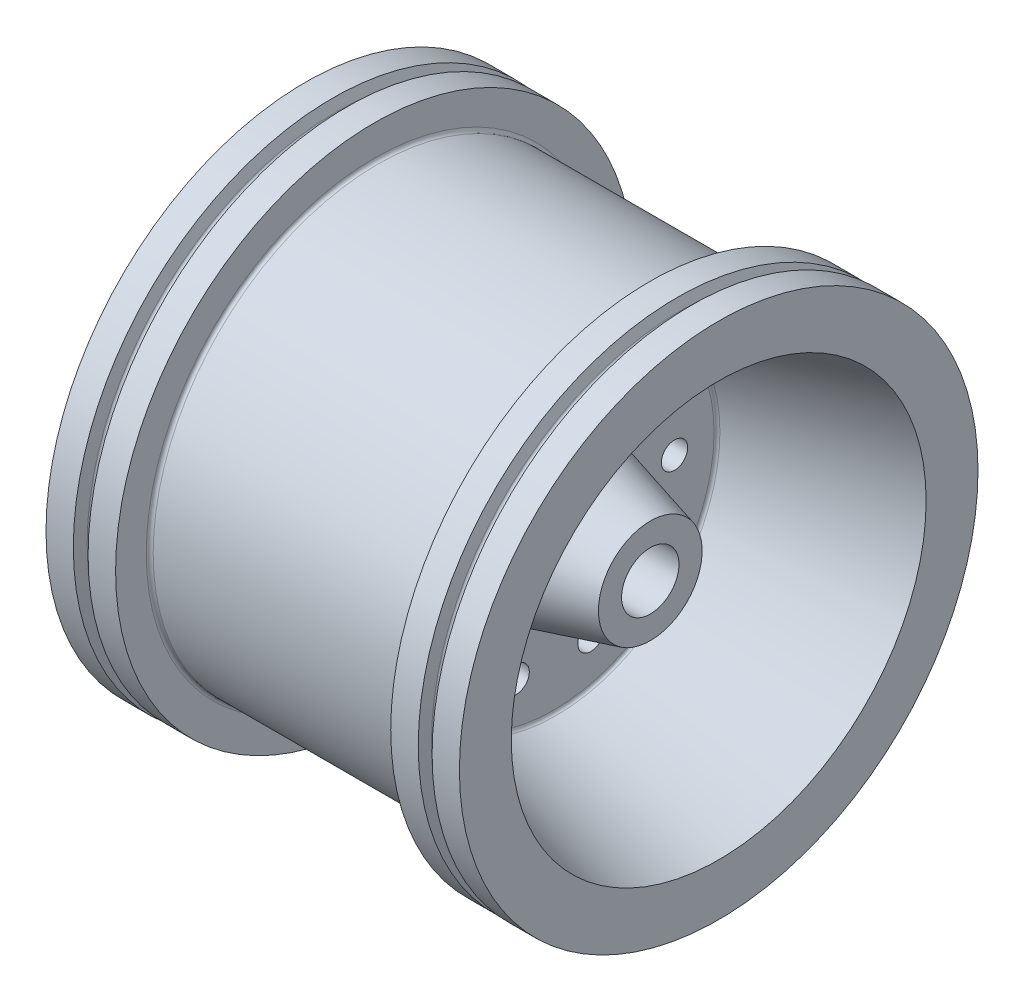
ISO-10303-21;
HEADER;
FILE_DESCRIPTION(('STEP AP214'),'2;1');
FILE_NAME('part.step','',(''),(''),'','','');
FILE_SCHEMA(('AUTOMOTIVE_DESIGN { 1 0 10303 214 1 1 1 1 }'));
ENDSEC;
DATA;
#1=APPLICATION_CONTEXT('core data for automotive mechanical design processes');
#2=APPLICATION_PROTOCOL_DEFINITION('international standard','automotive_design',2000,#1);
#3=PRODUCT_CONTEXT('',#1,'mechanical');
#4=PRODUCT('Part','Part','',(#3));
#5=PRODUCT_RELATED_PRODUCT_CATEGORY('part','',(#4));
#6=PRODUCT_DEFINITION_FORMATION('','',#4);
#7=PRODUCT_DEFINITION_CONTEXT('part definition',#1,'design');
#8=PRODUCT_DEFINITION('design','',#6,#7);
#9=PRODUCT_DEFINITION_SHAPE('','',#8);
#10=(LENGTH_UNIT() NAMED_UNIT(*) SI_UNIT(.MILLI.,.METRE.));
#11=(NAMED_UNIT(*) PLANE_ANGLE_UNIT() SI_UNIT($,.RADIAN.));
#12=(NAMED_UNIT(*) SI_UNIT($,.STERADIAN.) SOLID_ANGLE_UNIT());
#13=UNCERTAINTY_MEASURE_WITH_UNIT(LENGTH_MEASURE(1.E-05),#10,'distance_accuracy_value','');
#14=(GEOMETRIC_REPRESENTATION_CONTEXT(3) GLOBAL_UNCERTAINTY_ASSIGNED_CONTEXT((#13)) GLOBAL_UNIT_ASSIGNED_CONTEXT((#10,
#11,#12)) REPRESENTATION_CONTEXT('',''));
#15=CARTESIAN_POINT('',(0.,0.,0.));
#16=DIRECTION('',(0.,0.,1.));
#17=DIRECTION('',(1.,0.,0.));
#18=AXIS2_PLACEMENT_3D('',#15,#16,#17);
#19=CARTESIAN_POINT('',(-439.542794810868,0.,0.));
#20=DIRECTION('',(-1.,0.,0.));
#21=DIRECTION('',(0.,0.,1.));
#22=AXIS2_PLACEMENT_3D('',#19,#20,#21);
#23=CYLINDRICAL_SURFACE('',#22,8.30861206738148);
#24=CARTESIAN_POINT('',(40.,0.,0.));
#25=DIRECTION('',(-1.,0.,0.));
#26=DIRECTION('',(0.,0.,1.));
#27=AXIS2_PLACEMENT_3D('',#24,#25,#26);
#28=CIRCLE('',#27,8.30861206738148);
#29=CARTESIAN_POINT('',(40.,0.,8.30861206738148));
#30=VERTEX_POINT('',#29);
#31=EDGE_CURVE('E178',#30,#30,#28,.T.);
#32=ORIENTED_EDGE('',*,*,#31,.F.);
#33=EDGE_LOOP('',(#32));
#34=FACE_BOUND('',#33,.T.);
#35=CARTESIAN_POINT('',(-33.1,0.,0.));
#36=DIRECTION('',(-1.,0.,0.));
#37=DIRECTION('',(0.,0.,1.));
#38=AXIS2_PLACEMENT_3D('',#35,#36,#37);
#39=CIRCLE('',#38,8.30861206738148);
#40=CARTESIAN_POINT('',(-33.1,0.,8.30861206738148));
#41=VERTEX_POINT('',#40);
#42=EDGE_CURVE('E124',#41,#41,#39,.F.);
#43=ORIENTED_EDGE('',*,*,#42,.F.);
#44=EDGE_LOOP('',(#43));
#45=FACE_BOUND('',#44,.T.);
#46=ADVANCED_FACE('F43',(#34,#45),#23,.F.);
#47=CARTESIAN_POINT('',(12.0096189432335,47.1969361522712,0.));
#48=DIRECTION('',(-1.,0.,0.));
#49=DIRECTION('',(0.,0.,1.));
#50=AXIS2_PLACEMENT_3D('',#47,#48,#49);
#51=PLANE('',#50);
#52=CARTESIAN_POINT('',(12.0096189432335,0.,0.));
#53=DIRECTION('',(-1.,0.,0.));
#54=DIRECTION('',(0.,0.,1.));
#55=AXIS2_PLACEMENT_3D('',#52,#53,#54);
#56=CIRCLE('',#55,46.4296091642922);
#57=CARTESIAN_POINT('',(12.0096189432335,0.,46.4296091642922));
#58=VERTEX_POINT('',#57);
#59=EDGE_CURVE('E51',#58,#58,#56,.F.);
#60=ORIENTED_EDGE('',*,*,#59,.T.);
#61=EDGE_LOOP('',(#60));
#62=FACE_BOUND('',#61,.T.);
#63=CARTESIAN_POINT('',(12.0096189432335,0.,0.));
#64=DIRECTION('',(-1.,0.,0.));
#65=DIRECTION('',(0.,0.,1.));
#66=AXIS2_PLACEMENT_3D('',#63,#64,#65);
#67=CIRCLE('',#66,23.267326987979);
#68=CARTESIAN_POINT('',(12.0096189432335,0.,23.267326987979));
#69=VERTEX_POINT('',#68);
#70=EDGE_CURVE('E56',#69,#69,#67,.T.);
#71=ORIENTED_EDGE('',*,*,#70,.T.);
#72=EDGE_LOOP('',(#71));
#73=FACE_BOUND('',#72,.T.);
#74=CARTESIAN_POINT('',(12.0096189432335,-20.5724838302362,-28.3155948031234));
#75=DIRECTION('',(1.,0.,0.));
#76=DIRECTION('',(0.,0.,-1.));
#77=AXIS2_PLACEMENT_3D('',#74,#75,#76);
#78=CIRCLE('',#77,3.81000000000002);
#79=CARTESIAN_POINT('',(12.0096189432335,-20.5724838302362,-32.1255948031235));
#80=VERTEX_POINT('',#79);
#81=EDGE_CURVE('E128',#80,#80,#78,.T.);
#82=ORIENTED_EDGE('',*,*,#81,.F.);
#83=EDGE_LOOP('',(#82));
#84=FACE_BOUND('',#83,.T.);
#85=CARTESIAN_POINT('',(12.0096189432335,-33.2869780703303,-10.8155948031235));
#86=DIRECTION('',(1.,0.,0.));
#87=DIRECTION('',(0.,0.,-1.));
#88=AXIS2_PLACEMENT_3D('',#85,#86,#87);
#89=CIRCLE('',#88,3.81000000000002);
#90=CARTESIAN_POINT('',(12.0096189432335,-33.2869780703303,-14.6255948031236));
#91=VERTEX_POINT('',#90);
#92=EDGE_CURVE('E134',#91,#91,#89,.T.);
#93=ORIENTED_EDGE('',*,*,#92,.F.);
#94=EDGE_LOOP('',(#93));
#95=FACE_BOUND('',#94,.T.);
#96=CARTESIAN_POINT('',(12.0096189432335,-33.2869780703305,10.8155948031228));
#97=DIRECTION('',(1.,0.,0.));
#98=DIRECTION('',(0.,0.,-1.));
#99=AXIS2_PLACEMENT_3D('',#96,#97,#98);
#100=CIRCLE('',#99,3.81000000000002);
#101=CARTESIAN_POINT('',(12.0096189432335,-33.2869780703305,7.00559480312282));
#102=VERTEX_POINT('',#101);
#103=EDGE_CURVE('E139',#102,#102,#100,.T.);
#104=ORIENTED_EDGE('',*,*,#103,.F.);
#105=EDGE_LOOP('',(#104));
#106=FACE_BOUND('',#105,.T.);
#107=CARTESIAN_POINT('',(12.0096189432335,-20.5724838302368,28.315594803123));
#108=DIRECTION('',(1.,0.,0.));
#109=DIRECTION('',(0.,0.,-1.));
#110=AXIS2_PLACEMENT_3D('',#107,#108,#109);
#111=CIRCLE('',#110,3.81000000000002);
#112=CARTESIAN_POINT('',(12.0096189432335,-20.5724838302368,24.505594803123));
#113=VERTEX_POINT('',#112);
#114=EDGE_CURVE('E144',#113,#113,#111,.T.);
#115=ORIENTED_EDGE('',*,*,#114,.F.);
#116=EDGE_LOOP('',(#115));
#117=FACE_BOUND('',#116,.T.);
#118=CARTESIAN_POINT('',(12.0096189432335,0.,35.));
#119=DIRECTION('',(1.,0.,0.));
#120=DIRECTION('',(0.,0.,-1.));
#121=AXIS2_PLACEMENT_3D('',#118,#119,#120);
#122=CIRCLE('',#121,3.81000000000002);
#123=CARTESIAN_POINT('',(12.0096189432335,0.,31.19));
#124=VERTEX_POINT('',#123);
#125=EDGE_CURVE('E149',#124,#124,#122,.T.);
#126=ORIENTED_EDGE('',*,*,#125,.F.);
#127=EDGE_LOOP('',(#126));
#128=FACE_BOUND('',#127,.T.);
#129=CARTESIAN_POINT('',(12.0096189432335,33.2869780703303,10.8155948031233));
#130=DIRECTION('',(1.,0.,0.));
#131=DIRECTION('',(0.,0.,-1.));
#132=AXIS2_PLACEMENT_3D('',#129,#130,#131);
#133=CIRCLE('',#132,3.81000000000002);
#134=CARTESIAN_POINT('',(12.0096189432335,33.2869780703303,7.00559480312329));
#135=VERTEX_POINT('',#134);
#136=EDGE_CURVE('E234',#135,#135,#133,.T.);
#137=ORIENTED_EDGE('',*,*,#136,.F.);
#138=EDGE_LOOP('',(#137));
#139=FACE_BOUND('',#138,.T.);
#140=CARTESIAN_POINT('',(12.0096189432335,33.2869780703304,-10.8155948031231));
#141=DIRECTION('',(1.,0.,0.));
#142=DIRECTION('',(0.,0.,-1.));
#143=AXIS2_PLACEMENT_3D('',#140,#141,#142);
#144=CIRCLE('',#143,3.81000000000002);
#145=CARTESIAN_POINT('',(12.0096189432335,33.2869780703304,-14.6255948031231));
#146=VERTEX_POINT('',#145);
#147=EDGE_CURVE('E226',#146,#146,#144,.T.);
#148=ORIENTED_EDGE('',*,*,#147,.F.);
#149=EDGE_LOOP('',(#148));
#150=FACE_BOUND('',#149,.T.);
#151=CARTESIAN_POINT('',(12.0096189432335,20.5724838302366,-28.3155948031231));
#152=DIRECTION('',(1.,0.,0.));
#153=DIRECTION('',(0.,0.,-1.));
#154=AXIS2_PLACEMENT_3D('',#151,#152,#153);
#155=CIRCLE('',#154,3.81000000000002);
#156=CARTESIAN_POINT('',(12.0096189432335,20.5724838302366,-32.1255948031232));
#157=VERTEX_POINT('',#156);
#158=EDGE_CURVE('E218',#157,#157,#155,.T.);
#159=ORIENTED_EDGE('',*,*,#158,.F.);
#160=EDGE_LOOP('',(#159));
#161=FACE_BOUND('',#160,.T.);
#162=CARTESIAN_POINT('',(12.0096189432335,0.,-35.));
#163=DIRECTION('',(1.,0.,0.));
#164=DIRECTION('',(0.,0.,-1.));
#165=AXIS2_PLACEMENT_3D('',#162,#163,#164);
#166=CIRCLE('',#165,3.81000000000002);
#167=CARTESIAN_POINT('',(12.0096189432335,0.,-38.81));
#168=VERTEX_POINT('',#167);
#169=EDGE_CURVE('E210',#168,#168,#166,.T.);
#170=ORIENTED_EDGE('',*,*,#169,.F.);
#171=EDGE_LOOP('',(#170));
#172=FACE_BOUND('',#171,.T.);
#173=CARTESIAN_POINT('',(12.0096189432335,20.5724838302364,28.3155948031233));
#174=DIRECTION('',(1.,0.,0.));
#175=DIRECTION('',(0.,0.,-1.));
#176=AXIS2_PLACEMENT_3D('',#173,#174,#175);
#177=CIRCLE('',#176,3.81000000000002);
#178=CARTESIAN_POINT('',(12.0096189432335,20.5724838302364,24.5055948031233));
#179=VERTEX_POINT('',#178);
#180=EDGE_CURVE('E154',#179,#179,#177,.T.);
#181=ORIENTED_EDGE('',*,*,#180,.F.);
#182=EDGE_LOOP('',(#181));
#183=FACE_BOUND('',#182,.T.);
#184=ADVANCED_FACE('F286',(#62,#73,#84,#95,#106,#117,#128,#139,#150,#161,#172,#183),#51,.F.);
#185=CARTESIAN_POINT('',(-439.542794810868,0.,0.));
#186=DIRECTION('',(-1.,0.,0.));
#187=DIRECTION('',(0.,0.,1.));
#188=AXIS2_PLACEMENT_3D('',#185,#186,#187);
#189=CYLINDRICAL_SURFACE('',#188,65.);
#190=CARTESIAN_POINT('',(38.7913037155069,0.,0.));
#191=DIRECTION('',(1.,0.,0.));
#192=DIRECTION('',(0.,0.,-1.));
#193=AXIS2_PLACEMENT_3D('',#190,#191,#192);
#194=CIRCLE('',#193,65.);
#195=CARTESIAN_POINT('',(38.7913037155069,0.,-65.));
#196=VERTEX_POINT('',#195);
#197=EDGE_CURVE('E91',#196,#196,#194,.F.);
#198=ORIENTED_EDGE('',*,*,#197,.T.);
#199=EDGE_LOOP('',(#198));
#200=FACE_BOUND('',#199,.T.);
#201=CARTESIAN_POINT('',(-38.7913037155069,0.,0.));
#202=DIRECTION('',(-1.,0.,0.));
#203=DIRECTION('',(0.,0.,1.));
#204=AXIS2_PLACEMENT_3D('',#201,#202,#203);
#205=CIRCLE('',#204,65.);
#206=CARTESIAN_POINT('',(-38.7913037155069,0.,65.));
#207=VERTEX_POINT('',#206);
#208=EDGE_CURVE('E95',#207,#207,#205,.F.);
#209=ORIENTED_EDGE('',*,*,#208,.T.);
#210=EDGE_LOOP('',(#209));
#211=FACE_BOUND('',#210,.T.);
#212=ADVANCED_FACE('F293',(#200,#211),#189,.T.);
#213=CARTESIAN_POINT('',(-39.7913037155069,65.,0.));
#214=DIRECTION('',(-1.,0.,0.));
#215=DIRECTION('',(0.,0.,1.));
#216=AXIS2_PLACEMENT_3D('',#213,#214,#215);
#217=PLANE('',#216);
#218=CARTESIAN_POINT('',(-39.7913037155069,0.,0.));
#219=DIRECTION('',(-1.,0.,0.));
#220=DIRECTION('',(0.,0.,1.));
#221=AXIS2_PLACEMENT_3D('',#218,#219,#220);
#222=CIRCLE('',#221,66.);
#223=CARTESIAN_POINT('',(-39.7913037155069,0.,66.));
#224=VERTEX_POINT('',#223);
#225=EDGE_CURVE('E67',#224,#224,#222,.T.);
#226=ORIENTED_EDGE('',*,*,#225,.T.);
#227=EDGE_LOOP('',(#226));
#228=FACE_BOUND('',#227,.T.);
#229=CARTESIAN_POINT('',(-39.7913037155069,0.,0.));
#230=DIRECTION('',(-1.,0.,0.));
#231=DIRECTION('',(0.,0.,1.));
#232=AXIS2_PLACEMENT_3D('',#229,#230,#231);
#233=CIRCLE('',#232,74.869572122947);
#234=CARTESIAN_POINT('',(-39.7913037155069,0.,74.869572122947));
#235=VERTEX_POINT('',#234);
#236=EDGE_CURVE('E123',#235,#235,#233,.T.);
#237=ORIENTED_EDGE('',*,*,#236,.F.);
#238=EDGE_LOOP('',(#237));
#239=FACE_BOUND('',#238,.T.);
#240=ADVANCED_FACE('F736',(#228,#239),#217,.F.);
#241=CARTESIAN_POINT('',(-439.542794810868,0.,0.));
#242=DIRECTION('',(-1.,0.,0.));
#243=DIRECTION('',(0.,0.,1.));
#244=AXIS2_PLACEMENT_3D('',#241,#242,#243);
#245=CYLINDRICAL_SURFACE('',#244,74.869572122947);
#246=CARTESIAN_POINT('',(-47.7504651995743,0.,0.));
#247=DIRECTION('',(-1.,0.,0.));
#248=DIRECTION('',(0.,0.,1.));
#249=AXIS2_PLACEMENT_3D('',#246,#247,#248);
#250=CIRCLE('',#249,74.869572122947);
#251=CARTESIAN_POINT('',(-47.7504651995743,0.,74.869572122947));
#252=VERTEX_POINT('',#251);
#253=EDGE_CURVE('E158',#252,#252,#250,.T.);
#254=ORIENTED_EDGE('',*,*,#253,.F.);
#255=EDGE_LOOP('',(#254));
#256=FACE_BOUND('',#255,.T.);
#257=ORIENTED_EDGE('',*,*,#236,.T.);
#258=EDGE_LOOP('',(#257));
#259=FACE_BOUND('',#258,.T.);
#260=ADVANCED_FACE('F726',(#256,#259),#245,.T.);
#261=CARTESIAN_POINT('',(-47.7504651995743,0.,0.));
#262=DIRECTION('',(1.,0.,0.));
#263=DIRECTION('',(0.,0.,-1.));
#264=AXIS2_PLACEMENT_3D('',#261,#262,#263);
#265=CONICAL_SURFACE('',#264,74.869572122947,1.17806532789478);
#266=CARTESIAN_POINT('',(-48.8673529939839,0.,0.));
#267=DIRECTION('',(1.,0.,0.));
#268=DIRECTION('',(0.,0.,-1.));
#269=AXIS2_PLACEMENT_3D('',#266,#267,#268);
#270=CIRCLE('',#269,72.1734098625897);
#271=CARTESIAN_POINT('',(-48.8673529939839,0.,-72.1734098625897));
#272=VERTEX_POINT('',#271);
#273=EDGE_CURVE('E71',#272,#272,#270,.T.);
#274=ORIENTED_EDGE('',*,*,#273,.T.);
#275=EDGE_LOOP('',(#274));
#276=FACE_BOUND('',#275,.T.);
#277=ORIENTED_EDGE('',*,*,#253,.T.);
#278=EDGE_LOOP('',(#277));
#279=FACE_BOUND('',#278,.T.);
#280=ADVANCED_FACE('F716',(#276,#279),#265,.T.);
#281=CARTESIAN_POINT('',(-49.7913037155069,0.,0.));
#282=DIRECTION('',(-1.,0.,0.));
#283=DIRECTION('',(0.,0.,1.));
#284=AXIS2_PLACEMENT_3D('',#281,#282,#283);
#285=CONICAL_SURFACE('',#284,69.9429968539872,1.17812916229758);
#286=CARTESIAN_POINT('',(-50.7151120580653,0.,0.));
#287=DIRECTION('',(-1.,0.,0.));
#288=DIRECTION('',(0.,0.,1.));
#289=AXIS2_PLACEMENT_3D('',#286,#287,#288);
#290=CIRCLE('',#289,72.1734688378879);
#291=CARTESIAN_POINT('',(-50.7151120580653,0.,72.1734688378879));
#292=VERTEX_POINT('',#291);
#293=EDGE_CURVE('E75',#292,#292,#290,.T.);
#294=ORIENTED_EDGE('',*,*,#293,.T.);
#295=EDGE_LOOP('',(#294));
#296=FACE_BOUND('',#295,.T.);
#297=CARTESIAN_POINT('',(-51.8857939078743,0.,0.));
#298=DIRECTION('',(-1.,0.,0.));
#299=DIRECTION('',(0.,0.,1.));
#300=AXIS2_PLACEMENT_3D('',#297,#298,#299);
#301=CIRCLE('',#300,75.);
#302=CARTESIAN_POINT('',(-51.8857939078743,0.,75.));
#303=VERTEX_POINT('',#302);
#304=EDGE_CURVE('E162',#303,#303,#301,.T.);
#305=ORIENTED_EDGE('',*,*,#304,.F.);
#306=EDGE_LOOP('',(#305));
#307=FACE_BOUND('',#306,.T.);
#308=ADVANCED_FACE('F706',(#296,#307),#285,.T.);
#309=CARTESIAN_POINT('',(-439.542794810868,0.,0.));
#310=DIRECTION('',(-1.,0.,0.));
#311=DIRECTION('',(0.,0.,1.));
#312=AXIS2_PLACEMENT_3D('',#309,#310,#311);
#313=CYLINDRICAL_SURFACE('',#312,75.);
#314=CARTESIAN_POINT('',(-59.7913037155069,0.,0.));
#315=DIRECTION('',(-1.,0.,0.));
#316=DIRECTION('',(0.,0.,1.));
#317=AXIS2_PLACEMENT_3D('',#314,#315,#316);
#318=CIRCLE('',#317,75.);
#319=CARTESIAN_POINT('',(-59.7913037155069,0.,75.));
#320=VERTEX_POINT('',#319);
#321=EDGE_CURVE('E166',#320,#320,#318,.T.);
#322=ORIENTED_EDGE('',*,*,#321,.F.);
#323=EDGE_LOOP('',(#322));
#324=FACE_BOUND('',#323,.T.);
#325=ORIENTED_EDGE('',*,*,#304,.T.);
#326=EDGE_LOOP('',(#325));
#327=FACE_BOUND('',#326,.T.);
#328=ADVANCED_FACE('F696',(#324,#327),#313,.T.);
#329=CARTESIAN_POINT('',(-59.791303715507,75.,0.));
#330=DIRECTION('',(1.,0.,0.));
#331=DIRECTION('',(0.,0.,-1.));
#332=AXIS2_PLACEMENT_3D('',#329,#330,#331);
#333=PLANE('',#332);
#334=CARTESIAN_POINT('',(-59.7913037155069,0.,0.));
#335=DIRECTION('',(-1.,0.,0.));
#336=DIRECTION('',(0.,0.,1.));
#337=AXIS2_PLACEMENT_3D('',#334,#335,#336);
#338=CIRCLE('',#337,60.);
#339=CARTESIAN_POINT('',(-59.7913037155069,0.,60.));
#340=VERTEX_POINT('',#339);
#341=EDGE_CURVE('E170',#340,#340,#338,.T.);
#342=ORIENTED_EDGE('',*,*,#341,.F.);
#343=EDGE_LOOP('',(#342));
#344=FACE_BOUND('',#343,.T.);
#345=ORIENTED_EDGE('',*,*,#321,.T.);
#346=EDGE_LOOP('',(#345));
#347=FACE_BOUND('',#346,.T.);
#348=ADVANCED_FACE('F687',(#344,#347),#333,.F.);
#349=CARTESIAN_POINT('',(-59.7913037155069,0.,0.));
#350=DIRECTION('',(-1.,0.,0.));
#351=DIRECTION('',(0.,0.,1.));
#352=AXIS2_PLACEMENT_3D('',#349,#350,#351);
#353=CONICAL_SURFACE('',#352,60.,0.261799387799143);
#354=CARTESIAN_POINT('',(-12.750799898131,0.,0.));
#355=DIRECTION('',(-1.,0.,0.));
#356=DIRECTION('',(0.,0.,1.));
#357=AXIS2_PLACEMENT_3D('',#354,#355,#356);
#358=CIRCLE('',#357,47.3955349905813);
#359=CARTESIAN_POINT('',(-12.750799898131,0.,47.3955349905813));
#360=VERTEX_POINT('',#359);
#361=EDGE_CURVE('E99',#360,#360,#358,.F.);
#362=ORIENTED_EDGE('',*,*,#361,.T.);
#363=EDGE_LOOP('',(#362));
#364=FACE_BOUND('',#363,.T.);
#365=ORIENTED_EDGE('',*,*,#341,.T.);
#366=EDGE_LOOP('',(#365));
#367=FACE_BOUND('',#366,.T.);
#368=ADVANCED_FACE('F282',(#364,#367),#353,.F.);
#369=CARTESIAN_POINT('',(-12.0096189432335,47.1969361522712,0.));
#370=DIRECTION('',(1.,0.,0.));
#371=DIRECTION('',(0.,0.,-1.));
#372=AXIS2_PLACEMENT_3D('',#369,#370,#371);
#373=PLANE('',#372);
#374=CARTESIAN_POINT('',(-12.0096189432335,0.,0.));
#375=DIRECTION('',(1.,0.,0.));
#376=DIRECTION('',(0.,0.,-1.));
#377=AXIS2_PLACEMENT_3D('',#374,#375,#376);
#378=CIRCLE('',#377,23.267326987979);
#379=CARTESIAN_POINT('',(-12.0096189432335,0.,-23.267326987979));
#380=VERTEX_POINT('',#379);
#381=EDGE_CURVE('E111',#380,#380,#378,.T.);
#382=ORIENTED_EDGE('',*,*,#381,.T.);
#383=EDGE_LOOP('',(#382));
#384=FACE_BOUND('',#383,.T.);
#385=CARTESIAN_POINT('',(-12.0096189432335,0.,0.));
#386=DIRECTION('',(1.,0.,0.));
#387=DIRECTION('',(0.,0.,-1.));
#388=AXIS2_PLACEMENT_3D('',#385,#386,#387);
#389=CIRCLE('',#388,46.4296091642922);
#390=CARTESIAN_POINT('',(-12.0096189432335,0.,-46.4296091642922));
#391=VERTEX_POINT('',#390);
#392=EDGE_CURVE('E115',#391,#391,#389,.F.);
#393=ORIENTED_EDGE('',*,*,#392,.T.);
#394=EDGE_LOOP('',(#393));
#395=FACE_BOUND('',#394,.T.);
#396=CARTESIAN_POINT('',(-12.0096189432335,-20.5724838302362,-28.3155948031234));
#397=DIRECTION('',(1.,0.,0.));
#398=DIRECTION('',(0.,0.,-1.));
#399=AXIS2_PLACEMENT_3D('',#396,#397,#398);
#400=CIRCLE('',#399,3.81000000000001);
#401=CARTESIAN_POINT('',(-12.0096189432335,-20.5724838302362,-32.1255948031234));
#402=VERTEX_POINT('',#401);
#403=EDGE_CURVE('E130',#402,#402,#400,.T.);
#404=ORIENTED_EDGE('',*,*,#403,.T.);
#405=EDGE_LOOP('',(#404));
#406=FACE_BOUND('',#405,.T.);
#407=CARTESIAN_POINT('',(-12.0096189432335,-33.2869780703303,-10.8155948031235));
#408=DIRECTION('',(1.,0.,0.));
#409=DIRECTION('',(0.,0.,-1.));
#410=AXIS2_PLACEMENT_3D('',#407,#408,#409);
#411=CIRCLE('',#410,3.81000000000001);
#412=CARTESIAN_POINT('',(-12.0096189432335,-33.2869780703303,-14.6255948031236));
#413=VERTEX_POINT('',#412);
#414=EDGE_CURVE('E135',#413,#413,#411,.T.);
#415=ORIENTED_EDGE('',*,*,#414,.T.);
#416=EDGE_LOOP('',(#415));
#417=FACE_BOUND('',#416,.T.);
#418=CARTESIAN_POINT('',(-12.0096189432335,-33.2869780703305,10.8155948031228));
#419=DIRECTION('',(1.,0.,0.));
#420=DIRECTION('',(0.,0.,-1.));
#421=AXIS2_PLACEMENT_3D('',#418,#419,#420);
#422=CIRCLE('',#421,3.81000000000001);
#423=CARTESIAN_POINT('',(-12.0096189432335,-33.2869780703305,7.00559480312283));
#424=VERTEX_POINT('',#423);
#425=EDGE_CURVE('E140',#424,#424,#422,.T.);
#426=ORIENTED_EDGE('',*,*,#425,.T.);
#427=EDGE_LOOP('',(#426));
#428=FACE_BOUND('',#427,.T.);
#429=CARTESIAN_POINT('',(-12.0096189432335,-20.5724838302368,28.315594803123));
#430=DIRECTION('',(1.,0.,0.));
#431=DIRECTION('',(0.,0.,-1.));
#432=AXIS2_PLACEMENT_3D('',#429,#430,#431);
#433=CIRCLE('',#432,3.81000000000001);
#434=CARTESIAN_POINT('',(-12.0096189432335,-20.5724838302368,24.505594803123));
#435=VERTEX_POINT('',#434);
#436=EDGE_CURVE('E145',#435,#435,#433,.T.);
#437=ORIENTED_EDGE('',*,*,#436,.T.);
#438=EDGE_LOOP('',(#437));
#439=FACE_BOUND('',#438,.T.);
#440=CARTESIAN_POINT('',(-12.0096189432335,0.,35.));
#441=DIRECTION('',(1.,0.,0.));
#442=DIRECTION('',(0.,0.,-1.));
#443=AXIS2_PLACEMENT_3D('',#440,#441,#442);
#444=CIRCLE('',#443,3.81000000000001);
#445=CARTESIAN_POINT('',(-12.0096189432335,0.,31.19));
#446=VERTEX_POINT('',#445);
#447=EDGE_CURVE('E150',#446,#446,#444,.T.);
#448=ORIENTED_EDGE('',*,*,#447,.T.);
#449=EDGE_LOOP('',(#448));
#450=FACE_BOUND('',#449,.T.);
#451=CARTESIAN_POINT('',(-12.0096189432335,20.5724838302364,28.3155948031233));
#452=DIRECTION('',(1.,0.,0.));
#453=DIRECTION('',(0.,0.,-1.));
#454=AXIS2_PLACEMENT_3D('',#451,#452,#453);
#455=CIRCLE('',#454,3.81000000000001);
#456=CARTESIAN_POINT('',(-12.0096189432335,20.5724838302364,24.5055948031233));
#457=VERTEX_POINT('',#456);
#458=EDGE_CURVE('E238',#457,#457,#455,.T.);
#459=ORIENTED_EDGE('',*,*,#458,.T.);
#460=EDGE_LOOP('',(#459));
#461=FACE_BOUND('',#460,.T.);
#462=CARTESIAN_POINT('',(-12.0096189432335,33.2869780703303,10.8155948031233));
#463=DIRECTION('',(1.,0.,0.));
#464=DIRECTION('',(0.,0.,-1.));
#465=AXIS2_PLACEMENT_3D('',#462,#463,#464);
#466=CIRCLE('',#465,3.81000000000001);
#467=CARTESIAN_POINT('',(-12.0096189432335,33.2869780703303,7.0055948031233));
#468=VERTEX_POINT('',#467);
#469=EDGE_CURVE('E230',#468,#468,#466,.T.);
#470=ORIENTED_EDGE('',*,*,#469,.T.);
#471=EDGE_LOOP('',(#470));
#472=FACE_BOUND('',#471,.T.);
#473=CARTESIAN_POINT('',(-12.0096189432335,33.2869780703304,-10.8155948031231));
#474=DIRECTION('',(1.,0.,0.));
#475=DIRECTION('',(0.,0.,-1.));
#476=AXIS2_PLACEMENT_3D('',#473,#474,#475);
#477=CIRCLE('',#476,3.81000000000001);
#478=CARTESIAN_POINT('',(-12.0096189432335,33.2869780703304,-14.6255948031231));
#479=VERTEX_POINT('',#478);
#480=EDGE_CURVE('E222',#479,#479,#477,.T.);
#481=ORIENTED_EDGE('',*,*,#480,.T.);
#482=EDGE_LOOP('',(#481));
#483=FACE_BOUND('',#482,.T.);
#484=CARTESIAN_POINT('',(-12.0096189432335,20.5724838302366,-28.3155948031231));
#485=DIRECTION('',(1.,0.,0.));
#486=DIRECTION('',(0.,0.,-1.));
#487=AXIS2_PLACEMENT_3D('',#484,#485,#486);
#488=CIRCLE('',#487,3.81000000000001);
#489=CARTESIAN_POINT('',(-12.0096189432335,20.5724838302366,-32.1255948031232));
#490=VERTEX_POINT('',#489);
#491=EDGE_CURVE('E214',#490,#490,#488,.T.);
#492=ORIENTED_EDGE('',*,*,#491,.T.);
#493=EDGE_LOOP('',(#492));
#494=FACE_BOUND('',#493,.T.);
#495=CARTESIAN_POINT('',(-12.0096189432335,0.,-35.));
#496=DIRECTION('',(1.,0.,0.));
#497=DIRECTION('',(0.,0.,-1.));
#498=AXIS2_PLACEMENT_3D('',#495,#496,#497);
#499=CIRCLE('',#498,3.81000000000001);
#500=CARTESIAN_POINT('',(-12.0096189432335,0.,-38.81));
#501=VERTEX_POINT('',#500);
#502=EDGE_CURVE('E206',#501,#501,#499,.T.);
#503=ORIENTED_EDGE('',*,*,#502,.T.);
#504=EDGE_LOOP('',(#503));
#505=FACE_BOUND('',#504,.T.);
#506=ADVANCED_FACE('F275',(#384,#395,#406,#417,#428,#439,#450,#461,#472,#483,#494,#505),#373,.F.);
#507=CARTESIAN_POINT('',(-12.0096189432335,0.,0.));
#508=DIRECTION('',(1.,0.,0.));
#509=DIRECTION('',(0.,0.,-1.));
#510=AXIS2_PLACEMENT_3D('',#507,#508,#509);
#511=CONICAL_SURFACE('',#510,22.5,0.26179938779915);
#512=CARTESIAN_POINT('',(-12.750799898131,0.,0.));
#513=DIRECTION('',(1.,0.,0.));
#514=DIRECTION('',(0.,0.,-1.));
#515=AXIS2_PLACEMENT_3D('',#512,#513,#514);
#516=CIRCLE('',#515,22.3014011616899);
#517=CARTESIAN_POINT('',(-12.750799898131,0.,-22.3014011616899));
#518=VERTEX_POINT('',#517);
#519=EDGE_CURVE('E119',#518,#518,#516,.F.);
#520=ORIENTED_EDGE('',*,*,#519,.T.);
#521=EDGE_LOOP('',(#520));
#522=FACE_BOUND('',#521,.T.);
#523=CARTESIAN_POINT('',(-40.,0.,0.));
#524=DIRECTION('',(-1.,0.,0.));
#525=DIRECTION('',(0.,0.,1.));
#526=AXIS2_PLACEMENT_3D('',#523,#524,#525);
#527=CIRCLE('',#526,15.);
#528=CARTESIAN_POINT('',(-40.,0.,15.));
#529=VERTEX_POINT('',#528);
#530=EDGE_CURVE('E174',#529,#529,#527,.T.);
#531=ORIENTED_EDGE('',*,*,#530,.F.);
#532=EDGE_LOOP('',(#531));
#533=FACE_BOUND('',#532,.T.);
#534=ADVANCED_FACE('F270',(#522,#533),#511,.T.);
#535=CARTESIAN_POINT('',(-40.,15.,0.));
#536=DIRECTION('',(1.,0.,0.));
#537=DIRECTION('',(0.,0.,-1.));
#538=AXIS2_PLACEMENT_3D('',#535,#536,#537);
#539=PLANE('',#538);
#540=CARTESIAN_POINT('',(-40.,0.,0.));
#541=DIRECTION('',(-1.,0.,0.));
#542=DIRECTION('',(0.,0.,1.));
#543=AXIS2_PLACEMENT_3D('',#540,#541,#542);
#544=CIRCLE('',#543,10.75);
#545=CARTESIAN_POINT('',(-40.,0.,10.75));
#546=VERTEX_POINT('',#545);
#547=EDGE_CURVE('E129',#546,#546,#544,.T.);
#548=ORIENTED_EDGE('',*,*,#547,.F.);
#549=EDGE_LOOP('',(#548));
#550=FACE_BOUND('',#549,.T.);
#551=ORIENTED_EDGE('',*,*,#530,.T.);
#552=EDGE_LOOP('',(#551));
#553=FACE_BOUND('',#552,.T.);
#554=ADVANCED_FACE('F266',(#550,#553),#539,.F.);
#555=CARTESIAN_POINT('',(40.,15.,0.));
#556=DIRECTION('',(-1.,0.,0.));
#557=DIRECTION('',(0.,0.,1.));
#558=AXIS2_PLACEMENT_3D('',#555,#556,#557);
#559=PLANE('',#558);
#560=CARTESIAN_POINT('',(40.,0.,0.));
#561=DIRECTION('',(-1.,0.,0.));
#562=DIRECTION('',(0.,0.,1.));
#563=AXIS2_PLACEMENT_3D('',#560,#561,#562);
#564=CIRCLE('',#563,15.);
#565=CARTESIAN_POINT('',(40.,0.,15.));
#566=VERTEX_POINT('',#565);
#567=EDGE_CURVE('E182',#566,#566,#564,.T.);
#568=ORIENTED_EDGE('',*,*,#567,.F.);
#569=EDGE_LOOP('',(#568));
#570=FACE_BOUND('',#569,.T.);
#571=ORIENTED_EDGE('',*,*,#31,.T.);
#572=EDGE_LOOP('',(#571));
#573=FACE_BOUND('',#572,.T.);
#574=ADVANCED_FACE('F269',(#570,#573),#559,.F.);
#575=CARTESIAN_POINT('',(40.,0.,0.));
#576=DIRECTION('',(-1.,0.,0.));
#577=DIRECTION('',(0.,0.,1.));
#578=AXIS2_PLACEMENT_3D('',#575,#576,#577);
#579=CONICAL_SURFACE('',#578,15.,0.26179938779915);
#580=CARTESIAN_POINT('',(12.750799898131,0.,0.));
#581=DIRECTION('',(-1.,0.,0.));
#582=DIRECTION('',(0.,0.,1.));
#583=AXIS2_PLACEMENT_3D('',#580,#581,#582);
#584=CIRCLE('',#583,22.3014011616899);
#585=CARTESIAN_POINT('',(12.750799898131,0.,22.3014011616899));
#586=VERTEX_POINT('',#585);
#587=EDGE_CURVE('E10',#586,#586,#584,.F.);
#588=ORIENTED_EDGE('',*,*,#587,.T.);
#589=EDGE_LOOP('',(#588));
#590=FACE_BOUND('',#589,.T.);
#591=ORIENTED_EDGE('',*,*,#567,.T.);
#592=EDGE_LOOP('',(#591));
#593=FACE_BOUND('',#592,.T.);
#594=ADVANCED_FACE('F300',(#590,#593),#579,.T.);
#595=CARTESIAN_POINT('',(12.0096189432335,0.,0.));
#596=DIRECTION('',(1.,0.,0.));
#597=DIRECTION('',(0.,0.,-1.));
#598=AXIS2_PLACEMENT_3D('',#595,#596,#597);
#599=CONICAL_SURFACE('',#598,47.1969361522712,0.261799387799143);
#600=CARTESIAN_POINT('',(12.750799898131,0.,0.));
#601=DIRECTION('',(1.,0.,0.));
#602=DIRECTION('',(0.,0.,-1.));
#603=AXIS2_PLACEMENT_3D('',#600,#601,#602);
#604=CIRCLE('',#603,47.3955349905813);
#605=CARTESIAN_POINT('',(12.750799898131,0.,-47.3955349905813));
#606=VERTEX_POINT('',#605);
#607=EDGE_CURVE('E61',#606,#606,#604,.F.);
#608=ORIENTED_EDGE('',*,*,#607,.T.);
#609=EDGE_LOOP('',(#608));
#610=FACE_BOUND('',#609,.T.);
#611=CARTESIAN_POINT('',(59.7913037155069,0.,0.));
#612=DIRECTION('',(-1.,0.,0.));
#613=DIRECTION('',(0.,0.,1.));
#614=AXIS2_PLACEMENT_3D('',#611,#612,#613);
#615=CIRCLE('',#614,60.);
#616=CARTESIAN_POINT('',(59.7913037155069,0.,60.));
#617=VERTEX_POINT('',#616);
#618=EDGE_CURVE('E186',#617,#617,#615,.T.);
#619=ORIENTED_EDGE('',*,*,#618,.F.);
#620=EDGE_LOOP('',(#619));
#621=FACE_BOUND('',#620,.T.);
#622=ADVANCED_FACE('F303',(#610,#621),#599,.F.);
#623=CARTESIAN_POINT('',(59.791303715507,75.,0.));
#624=DIRECTION('',(-1.,0.,0.));
#625=DIRECTION('',(0.,0.,1.));
#626=AXIS2_PLACEMENT_3D('',#623,#624,#625);
#627=PLANE('',#626);
#628=CARTESIAN_POINT('',(59.7913037155069,0.,0.));
#629=DIRECTION('',(-1.,0.,0.));
#630=DIRECTION('',(0.,0.,1.));
#631=AXIS2_PLACEMENT_3D('',#628,#629,#630);
#632=CIRCLE('',#631,75.);
#633=CARTESIAN_POINT('',(59.7913037155069,0.,75.));
#634=VERTEX_POINT('',#633);
#635=EDGE_CURVE('E190',#634,#634,#632,.T.);
#636=ORIENTED_EDGE('',*,*,#635,.F.);
#637=EDGE_LOOP('',(#636));
#638=FACE_BOUND('',#637,.T.);
#639=ORIENTED_EDGE('',*,*,#618,.T.);
#640=EDGE_LOOP('',(#639));
#641=FACE_BOUND('',#640,.T.);
#642=ADVANCED_FACE('F307',(#638,#641),#627,.F.);
#643=CARTESIAN_POINT('',(-439.542794810868,0.,0.));
#644=DIRECTION('',(-1.,0.,0.));
#645=DIRECTION('',(0.,0.,1.));
#646=AXIS2_PLACEMENT_3D('',#643,#644,#645);
#647=CYLINDRICAL_SURFACE('',#646,75.);
#648=CARTESIAN_POINT('',(51.8857939078743,0.,0.));
#649=DIRECTION('',(-1.,0.,0.));
#650=DIRECTION('',(0.,0.,1.));
#651=AXIS2_PLACEMENT_3D('',#648,#649,#650);
#652=CIRCLE('',#651,75.);
#653=CARTESIAN_POINT('',(51.8857939078743,0.,75.));
#654=VERTEX_POINT('',#653);
#655=EDGE_CURVE('E194',#654,#654,#652,.T.);
#656=ORIENTED_EDGE('',*,*,#655,.F.);
#657=EDGE_LOOP('',(#656));
#658=FACE_BOUND('',#657,.T.);
#659=ORIENTED_EDGE('',*,*,#635,.T.);
#660=EDGE_LOOP('',(#659));
#661=FACE_BOUND('',#660,.T.);
#662=ADVANCED_FACE('F311',(#658,#661),#647,.T.);
#663=CARTESIAN_POINT('',(51.8857939078743,0.,0.));
#664=DIRECTION('',(1.,0.,0.));
#665=DIRECTION('',(0.,0.,-1.));
#666=AXIS2_PLACEMENT_3D('',#663,#664,#665);
#667=CONICAL_SURFACE('',#666,75.,1.17812916229758);
#668=CARTESIAN_POINT('',(50.7151120580653,0.,0.));
#669=DIRECTION('',(1.,0.,0.));
#670=DIRECTION('',(0.,0.,-1.));
#671=AXIS2_PLACEMENT_3D('',#668,#669,#670);
#672=CIRCLE('',#671,72.1734688378879);
#673=CARTESIAN_POINT('',(50.7151120580653,0.,-72.1734688378879));
#674=VERTEX_POINT('',#673);
#675=EDGE_CURVE('E79',#674,#674,#672,.T.);
#676=ORIENTED_EDGE('',*,*,#675,.T.);
#677=EDGE_LOOP('',(#676));
#678=FACE_BOUND('',#677,.T.);
#679=ORIENTED_EDGE('',*,*,#655,.T.);
#680=EDGE_LOOP('',(#679));
#681=FACE_BOUND('',#680,.T.);
#682=ADVANCED_FACE('F315',(#678,#681),#667,.T.);
#683=CARTESIAN_POINT('',(49.7913037155069,0.,0.));
#684=DIRECTION('',(-1.,0.,0.));
#685=DIRECTION('',(0.,0.,1.));
#686=AXIS2_PLACEMENT_3D('',#683,#684,#685);
#687=CONICAL_SURFACE('',#686,69.9429968539872,1.17806532789478);
#688=CARTESIAN_POINT('',(48.8673529939839,0.,0.));
#689=DIRECTION('',(-1.,0.,0.));
#690=DIRECTION('',(0.,0.,1.));
#691=AXIS2_PLACEMENT_3D('',#688,#689,#690);
#692=CIRCLE('',#691,72.1734098625897);
#693=CARTESIAN_POINT('',(48.8673529939839,0.,72.1734098625897));
#694=VERTEX_POINT('',#693);
#695=EDGE_CURVE('E83',#694,#694,#692,.T.);
#696=ORIENTED_EDGE('',*,*,#695,.T.);
#697=EDGE_LOOP('',(#696));
#698=FACE_BOUND('',#697,.T.);
#699=CARTESIAN_POINT('',(47.7504651995743,0.,0.));
#700=DIRECTION('',(-1.,0.,0.));
#701=DIRECTION('',(0.,0.,1.));
#702=AXIS2_PLACEMENT_3D('',#699,#700,#701);
#703=CIRCLE('',#702,74.869572122947);
#704=CARTESIAN_POINT('',(47.7504651995743,0.,74.869572122947));
#705=VERTEX_POINT('',#704);
#706=EDGE_CURVE('E198',#705,#705,#703,.T.);
#707=ORIENTED_EDGE('',*,*,#706,.F.);
#708=EDGE_LOOP('',(#707));
#709=FACE_BOUND('',#708,.T.);
#710=ADVANCED_FACE('F319',(#698,#709),#687,.T.);
#711=CARTESIAN_POINT('',(-439.542794810868,0.,0.));
#712=DIRECTION('',(-1.,0.,0.));
#713=DIRECTION('',(0.,0.,1.));
#714=AXIS2_PLACEMENT_3D('',#711,#712,#713);
#715=CYLINDRICAL_SURFACE('',#714,74.869572122947);
#716=CARTESIAN_POINT('',(39.7913037155069,0.,0.));
#717=DIRECTION('',(-1.,0.,0.));
#718=DIRECTION('',(0.,0.,1.));
#719=AXIS2_PLACEMENT_3D('',#716,#717,#718);
#720=CIRCLE('',#719,74.869572122947);
#721=CARTESIAN_POINT('',(39.7913037155069,0.,74.869572122947));
#722=VERTEX_POINT('',#721);
#723=EDGE_CURVE('E202',#722,#722,#720,.T.);
#724=ORIENTED_EDGE('',*,*,#723,.F.);
#725=EDGE_LOOP('',(#724));
#726=FACE_BOUND('',#725,.T.);
#727=ORIENTED_EDGE('',*,*,#706,.T.);
#728=EDGE_LOOP('',(#727));
#729=FACE_BOUND('',#728,.T.);
#730=ADVANCED_FACE('F323',(#726,#729),#715,.T.);
#731=CARTESIAN_POINT('',(39.7913037155069,65.,0.));
#732=DIRECTION('',(1.,0.,0.));
#733=DIRECTION('',(0.,0.,-1.));
#734=AXIS2_PLACEMENT_3D('',#731,#732,#733);
#735=PLANE('',#734);
#736=CARTESIAN_POINT('',(39.7913037155069,0.,0.));
#737=DIRECTION('',(1.,0.,0.));
#738=DIRECTION('',(0.,0.,-1.));
#739=AXIS2_PLACEMENT_3D('',#736,#737,#738);
#740=CIRCLE('',#739,66.);
#741=CARTESIAN_POINT('',(39.7913037155069,0.,-66.));
#742=VERTEX_POINT('',#741);
#743=EDGE_CURVE('E87',#742,#742,#740,.T.);
#744=ORIENTED_EDGE('',*,*,#743,.T.);
#745=EDGE_LOOP('',(#744));
#746=FACE_BOUND('',#745,.T.);
#747=ORIENTED_EDGE('',*,*,#723,.T.);
#748=EDGE_LOOP('',(#747));
#749=FACE_BOUND('',#748,.T.);
#750=ADVANCED_FACE('F327',(#746,#749),#735,.F.);
#751=CARTESIAN_POINT('',(12.0096189432335,0.,-35.));
#752=DIRECTION('',(1.,0.,0.));
#753=DIRECTION('',(0.,0.,-1.));
#754=AXIS2_PLACEMENT_3D('',#751,#752,#753);
#755=CYLINDRICAL_SURFACE('',#754,3.81000000000001);
#756=ORIENTED_EDGE('',*,*,#169,.T.);
#757=EDGE_LOOP('',(#756));
#758=FACE_BOUND('',#757,.T.);
#759=ORIENTED_EDGE('',*,*,#502,.F.);
#760=EDGE_LOOP('',(#759));
#761=FACE_BOUND('',#760,.T.);
#762=ADVANCED_FACE('F331',(#758,#761),#755,.F.);
#763=CARTESIAN_POINT('',(12.0096189432335,20.5724838302366,-28.3155948031231));
#764=DIRECTION('',(1.,0.,0.));
#765=DIRECTION('',(0.,0.,-1.));
#766=AXIS2_PLACEMENT_3D('',#763,#764,#765);
#767=CYLINDRICAL_SURFACE('',#766,3.81000000000001);
#768=ORIENTED_EDGE('',*,*,#158,.T.);
#769=EDGE_LOOP('',(#768));
#770=FACE_BOUND('',#769,.T.);
#771=ORIENTED_EDGE('',*,*,#491,.F.);
#772=EDGE_LOOP('',(#771));
#773=FACE_BOUND('',#772,.T.);
#774=ADVANCED_FACE('F335',(#770,#773),#767,.F.);
#775=CARTESIAN_POINT('',(12.0096189432335,33.2869780703304,-10.8155948031231));
#776=DIRECTION('',(1.,0.,0.));
#777=DIRECTION('',(0.,0.,-1.));
#778=AXIS2_PLACEMENT_3D('',#775,#776,#777);
#779=CYLINDRICAL_SURFACE('',#778,3.81000000000001);
#780=ORIENTED_EDGE('',*,*,#147,.T.);
#781=EDGE_LOOP('',(#780));
#782=FACE_BOUND('',#781,.T.);
#783=ORIENTED_EDGE('',*,*,#480,.F.);
#784=EDGE_LOOP('',(#783));
#785=FACE_BOUND('',#784,.T.);
#786=ADVANCED_FACE('F339',(#782,#785),#779,.F.);
#787=CARTESIAN_POINT('',(12.0096189432335,33.2869780703303,10.8155948031233));
#788=DIRECTION('',(1.,0.,0.));
#789=DIRECTION('',(0.,0.,-1.));
#790=AXIS2_PLACEMENT_3D('',#787,#788,#789);
#791=CYLINDRICAL_SURFACE('',#790,3.81000000000001);
#792=ORIENTED_EDGE('',*,*,#136,.T.);
#793=EDGE_LOOP('',(#792));
#794=FACE_BOUND('',#793,.T.);
#795=ORIENTED_EDGE('',*,*,#469,.F.);
#796=EDGE_LOOP('',(#795));
#797=FACE_BOUND('',#796,.T.);
#798=ADVANCED_FACE('F343',(#794,#797),#791,.F.);
#799=CARTESIAN_POINT('',(12.0096189432335,20.5724838302364,28.3155948031233));
#800=DIRECTION('',(1.,0.,0.));
#801=DIRECTION('',(0.,0.,-1.));
#802=AXIS2_PLACEMENT_3D('',#799,#800,#801);
#803=CYLINDRICAL_SURFACE('',#802,3.81000000000001);
#804=ORIENTED_EDGE('',*,*,#180,.T.);
#805=EDGE_LOOP('',(#804));
#806=FACE_BOUND('',#805,.T.);
#807=ORIENTED_EDGE('',*,*,#458,.F.);
#808=EDGE_LOOP('',(#807));
#809=FACE_BOUND('',#808,.T.);
#810=ADVANCED_FACE('F347',(#806,#809),#803,.F.);
#811=CARTESIAN_POINT('',(12.0096189432335,0.,35.));
#812=DIRECTION('',(1.,0.,0.));
#813=DIRECTION('',(0.,0.,-1.));
#814=AXIS2_PLACEMENT_3D('',#811,#812,#813);
#815=CYLINDRICAL_SURFACE('',#814,3.81000000000001);
#816=ORIENTED_EDGE('',*,*,#125,.T.);
#817=EDGE_LOOP('',(#816));
#818=FACE_BOUND('',#817,.T.);
#819=ORIENTED_EDGE('',*,*,#447,.F.);
#820=EDGE_LOOP('',(#819));
#821=FACE_BOUND('',#820,.T.);
#822=ADVANCED_FACE('F351',(#818,#821),#815,.F.);
#823=CARTESIAN_POINT('',(12.0096189432335,-20.5724838302368,28.315594803123));
#824=DIRECTION('',(1.,0.,0.));
#825=DIRECTION('',(0.,0.,-1.));
#826=AXIS2_PLACEMENT_3D('',#823,#824,#825);
#827=CYLINDRICAL_SURFACE('',#826,3.81000000000001);
#828=ORIENTED_EDGE('',*,*,#114,.T.);
#829=EDGE_LOOP('',(#828));
#830=FACE_BOUND('',#829,.T.);
#831=ORIENTED_EDGE('',*,*,#436,.F.);
#832=EDGE_LOOP('',(#831));
#833=FACE_BOUND('',#832,.T.);
#834=ADVANCED_FACE('F355',(#830,#833),#827,.F.);
#835=CARTESIAN_POINT('',(12.0096189432335,-33.2869780703305,10.8155948031228));
#836=DIRECTION('',(1.,0.,0.));
#837=DIRECTION('',(0.,0.,-1.));
#838=AXIS2_PLACEMENT_3D('',#835,#836,#837);
#839=CYLINDRICAL_SURFACE('',#838,3.81000000000001);
#840=ORIENTED_EDGE('',*,*,#103,.T.);
#841=EDGE_LOOP('',(#840));
#842=FACE_BOUND('',#841,.T.);
#843=ORIENTED_EDGE('',*,*,#425,.F.);
#844=EDGE_LOOP('',(#843));
#845=FACE_BOUND('',#844,.T.);
#846=ADVANCED_FACE('F359',(#842,#845),#839,.F.);
#847=CARTESIAN_POINT('',(12.0096189432335,-33.2869780703303,-10.8155948031235));
#848=DIRECTION('',(1.,0.,0.));
#849=DIRECTION('',(0.,0.,-1.));
#850=AXIS2_PLACEMENT_3D('',#847,#848,#849);
#851=CYLINDRICAL_SURFACE('',#850,3.81000000000001);
#852=ORIENTED_EDGE('',*,*,#92,.T.);
#853=EDGE_LOOP('',(#852));
#854=FACE_BOUND('',#853,.T.);
#855=ORIENTED_EDGE('',*,*,#414,.F.);
#856=EDGE_LOOP('',(#855));
#857=FACE_BOUND('',#856,.T.);
#858=ADVANCED_FACE('F363',(#854,#857),#851,.F.);
#859=CARTESIAN_POINT('',(12.0096189432335,-20.5724838302362,-28.3155948031234));
#860=DIRECTION('',(1.,0.,0.));
#861=DIRECTION('',(0.,0.,-1.));
#862=AXIS2_PLACEMENT_3D('',#859,#860,#861);
#863=CYLINDRICAL_SURFACE('',#862,3.81000000000001);
#864=ORIENTED_EDGE('',*,*,#81,.T.);
#865=EDGE_LOOP('',(#864));
#866=FACE_BOUND('',#865,.T.);
#867=ORIENTED_EDGE('',*,*,#403,.F.);
#868=EDGE_LOOP('',(#867));
#869=FACE_BOUND('',#868,.T.);
#870=ADVANCED_FACE('F367',(#866,#869),#863,.F.);
#871=CARTESIAN_POINT('',(-33.1,0.,0.));
#872=DIRECTION('',(-1.,0.,0.));
#873=DIRECTION('',(0.,0.,1.));
#874=AXIS2_PLACEMENT_3D('',#871,#872,#873);
#875=PLANE('',#874);
#876=CARTESIAN_POINT('',(-33.1,0.,0.));
#877=DIRECTION('',(-1.,0.,0.));
#878=DIRECTION('',(0.,0.,1.));
#879=AXIS2_PLACEMENT_3D('',#876,#877,#878);
#880=CIRCLE('',#879,9.75);
#881=CARTESIAN_POINT('',(-33.1,0.,9.75));
#882=VERTEX_POINT('',#881);
#883=EDGE_CURVE('E107',#882,#882,#880,.T.);
#884=ORIENTED_EDGE('',*,*,#883,.T.);
#885=EDGE_LOOP('',(#884));
#886=FACE_BOUND('',#885,.T.);
#887=ORIENTED_EDGE('',*,*,#42,.T.);
#888=EDGE_LOOP('',(#887));
#889=FACE_BOUND('',#888,.T.);
#890=ADVANCED_FACE('F370',(#886,#889),#875,.T.);
#891=CARTESIAN_POINT('',(-33.1,0.,0.));
#892=DIRECTION('',(-1.,0.,0.));
#893=DIRECTION('',(0.,0.,1.));
#894=AXIS2_PLACEMENT_3D('',#891,#892,#893);
#895=CYLINDRICAL_SURFACE('',#894,10.75);
#896=CARTESIAN_POINT('',(-34.1,0.,0.));
#897=DIRECTION('',(-1.,0.,0.));
#898=DIRECTION('',(0.,0.,1.));
#899=AXIS2_PLACEMENT_3D('',#896,#897,#898);
#900=CIRCLE('',#899,10.75);
#901=CARTESIAN_POINT('',(-34.1,0.,10.75));
#902=VERTEX_POINT('',#901);
#903=EDGE_CURVE('E103',#902,#902,#900,.F.);
#904=CARTESIAN_POINT('',(-34.1,0.,10.75));
#905=CARTESIAN_POINT('',(-34.1614583333333,0.,10.75));
#906=CARTESIAN_POINT('',(-34.2229166666666,0.,10.75));
#907=CARTESIAN_POINT('',(-34.3458333333333,0.,10.75));
#908=CARTESIAN_POINT('',(-34.4072916666667,0.,10.75));
#909=CARTESIAN_POINT('',(-34.5302083333333,0.,10.75));
#910=CARTESIAN_POINT('',(-34.5916666666667,0.,10.75));
#911=CARTESIAN_POINT('',(-34.7145833333333,0.,10.75));
#912=CARTESIAN_POINT('',(-34.7760416666667,0.,10.75));
#913=CARTESIAN_POINT('',(-34.8989583333333,0.,10.75));
#914=CARTESIAN_POINT('',(-34.9604166666667,0.,10.75));
#915=CARTESIAN_POINT('',(-35.0833333333333,0.,10.75));
#916=CARTESIAN_POINT('',(-35.1447916666667,0.,10.75));
#917=CARTESIAN_POINT('',(-35.2677083333333,0.,10.75));
#918=CARTESIAN_POINT('',(-35.3291666666667,0.,10.75));
#919=CARTESIAN_POINT('',(-35.4520833333333,0.,10.75));
#920=CARTESIAN_POINT('',(-35.5135416666667,0.,10.75));
#921=CARTESIAN_POINT('',(-35.6364583333333,0.,10.75));
#922=CARTESIAN_POINT('',(-35.6979166666667,0.,10.75));
#923=CARTESIAN_POINT('',(-35.8208333333333,0.,10.75));
#924=CARTESIAN_POINT('',(-35.8822916666667,0.,10.75));
#925=CARTESIAN_POINT('',(-36.0052083333333,0.,10.75));
#926=CARTESIAN_POINT('',(-36.0666666666667,0.,10.75));
#927=CARTESIAN_POINT('',(-36.1895833333333,0.,10.75));
#928=CARTESIAN_POINT('',(-36.2510416666667,0.,10.75));
#929=CARTESIAN_POINT('',(-36.3739583333333,0.,10.75));
#930=CARTESIAN_POINT('',(-36.4354166666667,0.,10.75));
#931=CARTESIAN_POINT('',(-36.5583333333333,0.,10.75));
#932=CARTESIAN_POINT('',(-36.6197916666667,0.,10.75));
#933=CARTESIAN_POINT('',(-36.7427083333333,0.,10.75));
#934=CARTESIAN_POINT('',(-36.8041666666667,0.,10.75));
#935=CARTESIAN_POINT('',(-36.9270833333333,0.,10.75));
#936=CARTESIAN_POINT('',(-36.9885416666666,0.,10.75));
#937=CARTESIAN_POINT('',(-37.1114583333333,0.,10.75));
#938=CARTESIAN_POINT('',(-37.1729166666667,0.,10.75));
#939=CARTESIAN_POINT('',(-37.2958333333333,0.,10.75));
#940=CARTESIAN_POINT('',(-37.3572916666667,0.,10.75));
#941=CARTESIAN_POINT('',(-37.4802083333333,0.,10.75));
#942=CARTESIAN_POINT('',(-37.5416666666667,0.,10.75));
#943=CARTESIAN_POINT('',(-37.6645833333333,0.,10.75));
#944=CARTESIAN_POINT('',(-37.7260416666667,0.,10.75));
#945=CARTESIAN_POINT('',(-37.8489583333333,0.,10.75));
#946=CARTESIAN_POINT('',(-37.9104166666667,0.,10.75));
#947=CARTESIAN_POINT('',(-38.0333333333333,0.,10.75));
#948=CARTESIAN_POINT('',(-38.0947916666667,0.,10.75));
#949=CARTESIAN_POINT('',(-38.2177083333333,0.,10.75));
#950=CARTESIAN_POINT('',(-38.2791666666667,0.,10.75));
#951=CARTESIAN_POINT('',(-38.4020833333333,0.,10.75));
#952=CARTESIAN_POINT('',(-38.4635416666667,0.,10.75));
#953=CARTESIAN_POINT('',(-38.5864583333333,0.,10.75));
#954=CARTESIAN_POINT('',(-38.6479166666667,0.,10.75));
#955=CARTESIAN_POINT('',(-38.7708333333333,0.,10.75));
#956=CARTESIAN_POINT('',(-38.8322916666667,0.,10.75));
#957=CARTESIAN_POINT('',(-38.9552083333333,0.,10.75));
#958=CARTESIAN_POINT('',(-39.0166666666667,0.,10.75));
#959=CARTESIAN_POINT('',(-39.1395833333333,0.,10.75));
#960=CARTESIAN_POINT('',(-39.2010416666667,0.,10.75));
#961=CARTESIAN_POINT('',(-39.3239583333333,0.,10.75));
#962=CARTESIAN_POINT('',(-39.3854166666667,0.,10.75));
#963=CARTESIAN_POINT('',(-39.5083333333333,0.,10.75));
#964=CARTESIAN_POINT('',(-39.5697916666667,0.,10.75));
#965=CARTESIAN_POINT('',(-39.6927083333333,0.,10.75));
#966=CARTESIAN_POINT('',(-39.7541666666667,0.,10.75));
#967=CARTESIAN_POINT('',(-39.8770833333333,0.,10.75));
#968=CARTESIAN_POINT('',(-39.9385416666667,0.,10.75));
#969=CARTESIAN_POINT('',(-40.,0.,10.75));
#970=B_SPLINE_CURVE_WITH_KNOTS('',3,(#904,#905,#906,#907,#908,#909,#910,#911,#912,#913,#914,
#915,#916,#917,#918,#919,#920,#921,#922,#923,#924,#925,#926,#927,#928,#929,#930,#931,#932,#933,
#934,#935,#936,#937,#938,#939,#940,#941,#942,#943,#944,#945,#946,#947,#948,#949,#950,#951,#952,
#953,#954,#955,#956,#957,#958,#959,#960,#961,#962,#963,#964,#965,#966,#967,#968,#969),
.UNSPECIFIED.,.F.,.F.,(4,2,2,2,2,2,2,2,2,2,2,2,2,2,2,2,2,2,2,2,2,2,2,2,2,2,2,2,2,2,2,2,4),(0.,
0.184375000000001,0.368750000000001,0.553125000000002,0.737500000000002,0.921875000000003,
1.10625,1.290625,1.475,1.659375,1.84375000000001,2.02812500000001,2.21250000000001,
2.39687500000001,2.58125000000001,2.765625,2.95,3.134375,3.31875,3.503125,3.6875,3.871875,
4.05625,4.240625,4.42500000000001,4.60937500000001,4.79375000000001,4.97812500000001,
5.16250000000001,5.34687500000001,5.53125000000001,5.715625,5.9),.UNSPECIFIED.);
#971=EDGE_CURVE('BSEAM264',#902,#546,#970,.T.);
#972=ORIENTED_EDGE('',*,*,#903,.T.);
#973=ORIENTED_EDGE('',*,*,#547,.T.);
#974=ORIENTED_EDGE('',*,*,#971,.T.);
#975=ORIENTED_EDGE('',*,*,#971,.F.);
#976=EDGE_LOOP('',(#972,#974,#973,#975));
#977=FACE_BOUND('',#976,.T.);
#978=ADVANCED_FACE('F264',(#977),#895,.F.);
#979=CARTESIAN_POINT('',(-13.0096189432335,0.,0.));
#980=DIRECTION('',(1.,0.,0.));
#981=DIRECTION('',(0.,0.,-1.));
#982=AXIS2_PLACEMENT_3D('',#979,#980,#981);
#983=TOROIDAL_SURFACE('',#982,23.267326987979,1.);
#984=ORIENTED_EDGE('',*,*,#381,.F.);
#985=EDGE_LOOP('',(#984));
#986=FACE_BOUND('',#985,.T.);
#987=ORIENTED_EDGE('',*,*,#519,.F.);
#988=EDGE_LOOP('',(#987));
#989=FACE_BOUND('',#988,.T.);
#990=ADVANCED_FACE('F374',(#986,#989),#983,.F.);
#991=CARTESIAN_POINT('',(-34.1,0.,0.));
#992=DIRECTION('',(-1.,0.,0.));
#993=DIRECTION('',(0.,0.,1.));
#994=AXIS2_PLACEMENT_3D('',#991,#992,#993);
#995=TOROIDAL_SURFACE('',#994,9.75,1.);
#996=ORIENTED_EDGE('',*,*,#903,.F.);
#997=EDGE_LOOP('',(#996));
#998=FACE_BOUND('',#997,.T.);
#999=ORIENTED_EDGE('',*,*,#883,.F.);
#1000=EDGE_LOOP('',(#999));
#1001=FACE_BOUND('',#1000,.T.);
#1002=ADVANCED_FACE('F383',(#998,#1001),#995,.F.);
#1003=CARTESIAN_POINT('',(-13.0096189432335,0.,0.));
#1004=DIRECTION('',(1.,0.,0.));
#1005=DIRECTION('',(0.,0.,-1.));
#1006=AXIS2_PLACEMENT_3D('',#1003,#1004,#1005);
#1007=TOROIDAL_SURFACE('',#1006,46.4296091642922,1.);
#1008=ORIENTED_EDGE('',*,*,#361,.F.);
#1009=EDGE_LOOP('',(#1008));
#1010=FACE_BOUND('',#1009,.T.);
#1011=ORIENTED_EDGE('',*,*,#392,.F.);
#1012=EDGE_LOOP('',(#1011));
#1013=FACE_BOUND('',#1012,.T.);
#1014=ADVANCED_FACE('F385',(#1010,#1013),#1007,.F.);
#1015=CARTESIAN_POINT('',(38.7913037155069,0.,0.));
#1016=DIRECTION('',(1.,0.,0.));
#1017=DIRECTION('',(0.,0.,-1.));
#1018=AXIS2_PLACEMENT_3D('',#1015,#1016,#1017);
#1019=TOROIDAL_SURFACE('',#1018,66.,1.);
#1020=ORIENTED_EDGE('',*,*,#743,.F.);
#1021=EDGE_LOOP('',(#1020));
#1022=FACE_BOUND('',#1021,.T.);
#1023=ORIENTED_EDGE('',*,*,#197,.F.);
#1024=EDGE_LOOP('',(#1023));
#1025=FACE_BOUND('',#1024,.T.);
#1026=ADVANCED_FACE('F392',(#1022,#1025),#1019,.F.);
#1027=CARTESIAN_POINT('',(49.7912203118404,0.,0.));
#1028=DIRECTION('',(-1.,0.,0.));
#1029=DIRECTION('',(0.,0.,1.));
#1030=AXIS2_PLACEMENT_3D('',#1027,#1028,#1029);
#1031=TOROIDAL_SURFACE('',#1030,72.556122782409,1.);
#1032=ORIENTED_EDGE('',*,*,#675,.F.);
#1033=EDGE_LOOP('',(#1032));
#1034=FACE_BOUND('',#1033,.T.);
#1035=ORIENTED_EDGE('',*,*,#695,.F.);
#1036=EDGE_LOOP('',(#1035));
#1037=FACE_BOUND('',#1036,.T.);
#1038=ADVANCED_FACE('F402',(#1034,#1037),#1031,.F.);
#1039=CARTESIAN_POINT('',(-49.7912203118404,0.,0.));
#1040=DIRECTION('',(-1.,0.,0.));
#1041=DIRECTION('',(0.,0.,1.));
#1042=AXIS2_PLACEMENT_3D('',#1039,#1040,#1041);
#1043=TOROIDAL_SURFACE('',#1042,72.556122782409,1.);
#1044=ORIENTED_EDGE('',*,*,#273,.F.);
#1045=EDGE_LOOP('',(#1044));
#1046=FACE_BOUND('',#1045,.T.);
#1047=ORIENTED_EDGE('',*,*,#293,.F.);
#1048=EDGE_LOOP('',(#1047));
#1049=FACE_BOUND('',#1048,.T.);
#1050=ADVANCED_FACE('F406',(#1046,#1049),#1043,.F.);
#1051=CARTESIAN_POINT('',(-38.7913037155069,0.,0.));
#1052=DIRECTION('',(-1.,0.,0.));
#1053=DIRECTION('',(0.,0.,1.));
#1054=AXIS2_PLACEMENT_3D('',#1051,#1052,#1053);
#1055=TOROIDAL_SURFACE('',#1054,66.,1.);
#1056=ORIENTED_EDGE('',*,*,#208,.F.);
#1057=EDGE_LOOP('',(#1056));
#1058=FACE_BOUND('',#1057,.T.);
#1059=ORIENTED_EDGE('',*,*,#225,.F.);
#1060=EDGE_LOOP('',(#1059));
#1061=FACE_BOUND('',#1060,.T.);
#1062=ADVANCED_FACE('F410',(#1058,#1061),#1055,.F.);
#1063=CARTESIAN_POINT('',(13.0096189432335,0.,0.));
#1064=DIRECTION('',(-1.,0.,0.));
#1065=DIRECTION('',(0.,0.,1.));
#1066=AXIS2_PLACEMENT_3D('',#1063,#1064,#1065);
#1067=TOROIDAL_SURFACE('',#1066,46.4296091642922,1.);
#1068=ORIENTED_EDGE('',*,*,#59,.F.);
#1069=EDGE_LOOP('',(#1068));
#1070=FACE_BOUND('',#1069,.T.);
#1071=ORIENTED_EDGE('',*,*,#607,.F.);
#1072=EDGE_LOOP('',(#1071));
#1073=FACE_BOUND('',#1072,.T.);
#1074=ADVANCED_FACE('F413',(#1070,#1073),#1067,.F.);
#1075=CARTESIAN_POINT('',(13.0096189432335,0.,0.));
#1076=DIRECTION('',(-1.,0.,0.));
#1077=DIRECTION('',(0.,0.,1.));
#1078=AXIS2_PLACEMENT_3D('',#1075,#1076,#1077);
#1079=TOROIDAL_SURFACE('',#1078,23.267326987979,1.);
#1080=ORIENTED_EDGE('',*,*,#587,.F.);
#1081=EDGE_LOOP('',(#1080));
#1082=FACE_BOUND('',#1081,.T.);
#1083=ORIENTED_EDGE('',*,*,#70,.F.);
#1084=EDGE_LOOP('',(#1083));
#1085=FACE_BOUND('',#1084,.T.);
#1086=ADVANCED_FACE('F45',(#1082,#1085),#1079,.F.);
#1087=CLOSED_SHELL('',(#46,#184,#212,#240,#260,#280,#308,#328,#348,#368,#506,#534,#554,#574,
#594,#622,#642,#662,#682,#710,#730,#750,#762,#774,#786,#798,#810,#822,#834,#846,#858,#870,#890,
#978,#990,#1002,#1014,#1026,#1038,#1050,#1062,#1074,#1086));
#1088=MANIFOLD_SOLID_BREP('B2',#1087);
#1089=ADVANCED_BREP_SHAPE_REPRESENTATION('',(#18,#1088),#14);
#1090=SHAPE_DEFINITION_REPRESENTATION(#9,#1089);
ENDSEC;
END-ISO-10303-21;
